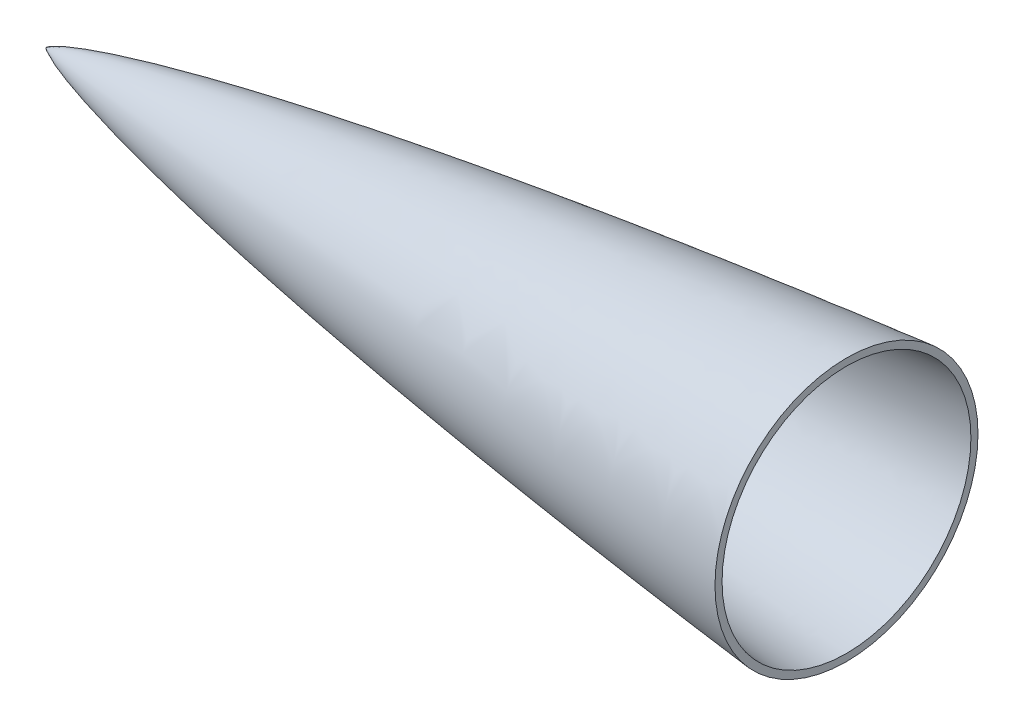
ISO-10303-21;
HEADER;
FILE_DESCRIPTION(('STEP AP214'),'2;1');
FILE_NAME('part.step','',(''),(''),'','','');
FILE_SCHEMA(('AUTOMOTIVE_DESIGN { 1 0 10303 214 1 1 1 1 }'));
ENDSEC;
DATA;
#1=APPLICATION_CONTEXT('core data for automotive mechanical design processes');
#2=APPLICATION_PROTOCOL_DEFINITION('international standard','automotive_design',2000,#1);
#3=PRODUCT_CONTEXT('',#1,'mechanical');
#4=PRODUCT('Part','Part','',(#3));
#5=PRODUCT_RELATED_PRODUCT_CATEGORY('part','',(#4));
#6=PRODUCT_DEFINITION_FORMATION('','',#4);
#7=PRODUCT_DEFINITION_CONTEXT('part definition',#1,'design');
#8=PRODUCT_DEFINITION('design','',#6,#7);
#9=PRODUCT_DEFINITION_SHAPE('','',#8);
#10=(LENGTH_UNIT() NAMED_UNIT(*) SI_UNIT(.MILLI.,.METRE.));
#11=(NAMED_UNIT(*) PLANE_ANGLE_UNIT() SI_UNIT($,.RADIAN.));
#12=(NAMED_UNIT(*) SI_UNIT($,.STERADIAN.) SOLID_ANGLE_UNIT());
#13=UNCERTAINTY_MEASURE_WITH_UNIT(LENGTH_MEASURE(1.E-05),#10,'distance_accuracy_value','');
#14=(GEOMETRIC_REPRESENTATION_CONTEXT(3) GLOBAL_UNCERTAINTY_ASSIGNED_CONTEXT((#13)) GLOBAL_UNIT_ASSIGNED_CONTEXT((#10,
#11,#12)) REPRESENTATION_CONTEXT('',''));
#15=CARTESIAN_POINT('',(0.,0.,0.));
#16=DIRECTION('',(0.,0.,1.));
#17=DIRECTION('',(1.,0.,0.));
#18=AXIS2_PLACEMENT_3D('',#15,#16,#17);
#19=CARTESIAN_POINT('',(186.200000001716,0.,-30.5941707055413));
#20=CARTESIAN_POINT('',(184.662407070498,0.,-30.4392578753995));
#21=CARTESIAN_POINT('',(181.664721368673,0.,-30.1345686695102));
#22=CARTESIAN_POINT('',(175.520193145997,0.,-29.5033768760439));
#23=CARTESIAN_POINT('',(169.640854592531,0.,-28.8781554590312));
#24=CARTESIAN_POINT('',(162.343077764836,0.,-28.0928203912281));
#25=CARTESIAN_POINT('',(155.948282856683,0.,-27.3807097930227));
#26=CARTESIAN_POINT('',(149.811116787043,0.,-26.6869796348611));
#27=CARTESIAN_POINT('',(144.877547534649,0.,-26.113408571817));
#28=CARTESIAN_POINT('',(139.753375696122,0.,-25.5108613461649));
#29=CARTESIAN_POINT('',(134.732708793236,0.,-24.9087817091693));
#30=CARTESIAN_POINT('',(128.81067856445,0.,-24.1848807119387));
#31=CARTESIAN_POINT('',(120.397645133949,0.,-23.1287132910105));
#32=CARTESIAN_POINT('',(110.285220260477,0.,-21.8148001535127));
#33=CARTESIAN_POINT('',(100.194023174279,0.,-20.4428386621385));
#34=CARTESIAN_POINT('',(90.1037764473322,0.,-19.003577807201));
#35=CARTESIAN_POINT('',(80.0264372503359,0.,-17.5059515675425));
#36=CARTESIAN_POINT('',(69.9564167642104,0.,-15.9447415224614));
#37=CARTESIAN_POINT('',(58.2260375733927,0.,-14.0196412347053));
#38=CARTESIAN_POINT('',(44.84839358411,0.,-11.6455232124935));
#39=CARTESIAN_POINT('',(32.222331949912,0.,-9.18514909763235));
#40=CARTESIAN_POINT('',(21.4403752490037,0.,-6.83377987904622));
#41=CARTESIAN_POINT('',(13.1064586472237,0.,-4.75920276513738));
#42=CARTESIAN_POINT('',(7.60236751203477,0.,-3.17385571636364));
#43=CARTESIAN_POINT('',(4.41392468250558,0.,-2.11488278146902));
#44=CARTESIAN_POINT('',(2.57407141296526,0.,-1.41163730075778));
#45=CARTESIAN_POINT('',(1.54018043583499,0.,-0.959829812667753));
#46=CARTESIAN_POINT('',(0.952068497650011,0.,-0.668617104150526));
#47=CARTESIAN_POINT('',(0.606995268094673,0.,-0.476664104372928));
#48=CARTESIAN_POINT('',(0.394881665147901,0.,-0.345155619052086));
#49=CARTESIAN_POINT('',(0.265098068533639,0.,-0.25590111197058));
#50=CARTESIAN_POINT('',(0.178077987085558,0.,-0.189836562428967));
#51=CARTESIAN_POINT('',(0.114237307946382,0.,-0.136257230623688));
#52=CARTESIAN_POINT('',(0.0700573409504292,0.,-0.0951693489716034));
#53=CARTESIAN_POINT('',(0.0337925470818379,0.,-0.0558676875837313));
#54=CARTESIAN_POINT('',(0.0110752134484783,0.,-0.0257358999075582));
#55=CARTESIAN_POINT('',(0.00310882406169207,0.,-0.00887746428807615));
#56=CARTESIAN_POINT('',(0.,0.,0.));
#57=B_SPLINE_CURVE_WITH_KNOTS('',4,(#19,#20,#21,#22,#23,#24,#25,#26,#27,#28,#29,#30,#31,#32,#33,
#34,#35,#36,#37,#38,#39,#40,#41,#42,#43,#44,#45,#46,#47,#48,#49,#50,#51,#52,#53,#54,#55,#56),
.UNSPECIFIED.,.F.,.F.,(5,1,1,1,1,1,1,1,1,1,1,1,1,1,1,1,1,1,1,1,1,1,1,1,1,1,1,1,1,1,1,1,1,1,5),
(0.,0.0326810335908452,0.0653620671816904,0.0980431008847118,0.130724134587733,
0.163405168367008,0.196086202146282,0.212426719054658,0.228767235963034,0.261448269779786,
0.294129303578273,0.32681033737676,0.392172404824504,0.457534472134687,0.490215505946359,
0.52289653975803,0.588258608906454,0.6536206730453,0.718982743065276,0.784344810540166,
0.835796033405464,0.865960446156128,0.884227223187027,0.894546329069303,0.900432579829851,
0.90385239756026,0.905932811279427,0.907170919997491,0.908028786361658,0.90865351857146,
0.908962980955325,0.90927244333919,0.909632668951372,0.909812781757463,0.909992894563555),.UNSPECIFIED.);
#58=CARTESIAN_POINT('',(0.,0.,0.));
#59=DIRECTION('',(-1.,0.,0.));
#60=AXIS1_PLACEMENT('',#58,#59);
#61=SURFACE_OF_REVOLUTION('',#57,#60);
#62=CARTESIAN_POINT('',(0.,0.,0.));
#63=VERTEX_POINT('',#62);
#64=VERTEX_LOOP('',#63);
#65=FACE_BOUND('',#64,.T.);
#66=CARTESIAN_POINT('',(186.200000001526,0.,0.));
#67=DIRECTION('',(-1.,0.,0.));
#68=DIRECTION('',(0.,0.,1.));
#69=AXIS2_PLACEMENT_3D('',#66,#67,#68);
#70=CIRCLE('',#69,30.594170705522);
#71=CARTESIAN_POINT('',(186.200000001526,0.,30.594170705522));
#72=VERTEX_POINT('',#71);
#73=EDGE_CURVE('E11',#72,#72,#70,.T.);
#74=ORIENTED_EDGE('',*,*,#73,.T.);
#75=EDGE_LOOP('',(#74));
#76=FACE_BOUND('',#75,.T.);
#77=ADVANCED_FACE('F43',(#65,#76),#61,.T.);
#78=CARTESIAN_POINT('',(186.200000001526,0.,0.));
#79=DIRECTION('',(-1.,0.,0.));
#80=DIRECTION('',(0.,0.,1.));
#81=AXIS2_PLACEMENT_3D('',#78,#79,#80);
#82=PLANE('',#81);
#83=CARTESIAN_POINT('',(186.200000001526,0.,0.));
#84=DIRECTION('',(-1.,0.,0.));
#85=DIRECTION('',(0.,0.,1.));
#86=AXIS2_PLACEMENT_3D('',#83,#84,#85);
#87=CIRCLE('',#86,28.9458624812022);
#88=CARTESIAN_POINT('',(186.200000001526,0.,28.9458624812022));
#89=VERTEX_POINT('',#88);
#90=EDGE_CURVE('E50',#89,#89,#87,.T.);
#91=ORIENTED_EDGE('',*,*,#90,.T.);
#92=EDGE_LOOP('',(#91));
#93=FACE_BOUND('',#92,.T.);
#94=ORIENTED_EDGE('',*,*,#73,.F.);
#95=EDGE_LOOP('',(#94));
#96=FACE_BOUND('',#95,.T.);
#97=ADVANCED_FACE('F59',(#93,#96),#82,.F.);
#98=CARTESIAN_POINT('',(186.200000001716,0.,-30.5941707055413));
#99=CARTESIAN_POINT('',(184.662407070498,0.,-30.4392578753995));
#100=CARTESIAN_POINT('',(181.664721368673,0.,-30.1345686695102));
#101=CARTESIAN_POINT('',(175.520193145997,0.,-29.5033768760439));
#102=CARTESIAN_POINT('',(169.640854592531,0.,-28.8781554590312));
#103=CARTESIAN_POINT('',(162.343077764836,0.,-28.0928203912281));
#104=CARTESIAN_POINT('',(155.948282856683,0.,-27.3807097930227));
#105=CARTESIAN_POINT('',(149.811116787043,0.,-26.6869796348611));
#106=CARTESIAN_POINT('',(144.877547534649,0.,-26.113408571817));
#107=CARTESIAN_POINT('',(139.753375696122,0.,-25.5108613461649));
#108=CARTESIAN_POINT('',(134.732708793236,0.,-24.9087817091693));
#109=CARTESIAN_POINT('',(128.81067856445,0.,-24.1848807119387));
#110=CARTESIAN_POINT('',(120.397645133949,0.,-23.1287132910105));
#111=CARTESIAN_POINT('',(110.285220260477,0.,-21.8148001535127));
#112=CARTESIAN_POINT('',(100.194023174279,0.,-20.4428386621385));
#113=CARTESIAN_POINT('',(90.1037764473322,0.,-19.003577807201));
#114=CARTESIAN_POINT('',(80.0264372503359,0.,-17.5059515675425));
#115=CARTESIAN_POINT('',(69.9564167642104,0.,-15.9447415224614));
#116=CARTESIAN_POINT('',(58.2260375733927,0.,-14.0196412347053));
#117=CARTESIAN_POINT('',(44.84839358411,0.,-11.6455232124935));
#118=CARTESIAN_POINT('',(32.222331949912,0.,-9.18514909763235));
#119=CARTESIAN_POINT('',(21.4403752490037,0.,-6.83377987904622));
#120=CARTESIAN_POINT('',(13.1064586472237,0.,-4.75920276513738));
#121=CARTESIAN_POINT('',(7.62339867588074,0.,-3.17991333654407));
#122=CARTESIAN_POINT('',(4.74583098973773,0.,-2.22511169914735));
#123=CARTESIAN_POINT('',(3.37403158686563,0.,-1.71435022640123));
#124=CARTESIAN_POINT('',(2.89554534508805,0.,-1.52569478658028));
#125=B_SPLINE_CURVE_WITH_KNOTS('',4,(#98,#99,#100,#101,#102,#103,#104,#105,#106,#107,#108,#109,
#110,#111,#112,#113,#114,#115,#116,#117,#118,#119,#120,#121,#122,#123,#124),.UNSPECIFIED.,.F.,
.F.,(5,1,1,1,1,1,1,1,1,1,1,1,1,1,1,1,1,1,1,1,1,1,1,5),(0.,0.0326810335908452,0.0653620671816904,
0.0980431008847118,0.130724134587733,0.163405168367008,0.196086202146282,0.212426719054658,
0.228767235963034,0.261448269779786,0.294129303578273,0.32681033737676,0.392172404824504,
0.457534472134687,0.490215505946359,0.52289653975803,0.588258608906454,0.6536206730453,
0.718982743065276,0.784344810540166,0.835796033405464,0.865960446156128,0.884227223187027,
0.894125248433947),.UNSPECIFIED.);
#126=CARTESIAN_POINT('',(0.,0.,0.));
#127=DIRECTION('',(-1.,0.,0.));
#128=AXIS1_PLACEMENT('',#126,#127);
#129=SURFACE_OF_REVOLUTION('',#125,#128);
#130=OFFSET_SURFACE('',#129,-1.64,.F.);
#131=CARTESIAN_POINT('',(3.49708953980836,0.,0.));
#132=VERTEX_POINT('',#131);
#133=VERTEX_LOOP('',#132);
#134=FACE_BOUND('',#133,.T.);
#135=ORIENTED_EDGE('',*,*,#90,.F.);
#136=EDGE_LOOP('',(#135));
#137=FACE_BOUND('',#136,.T.);
#138=ADVANCED_FACE('F56',(#134,#137),#130,.F.);
#139=CLOSED_SHELL('',(#77,#97,#138));
#140=MANIFOLD_SOLID_BREP('B2',#139);
#141=ADVANCED_BREP_SHAPE_REPRESENTATION('',(#18,#140),#14);
#142=SHAPE_DEFINITION_REPRESENTATION(#9,#141);
ENDSEC;
END-ISO-10303-21;
